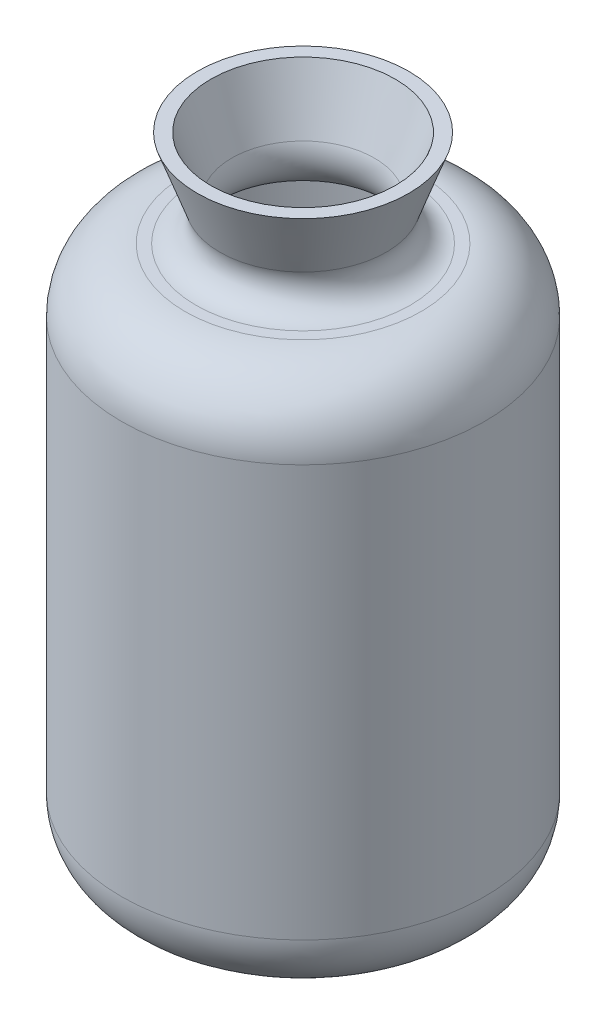
ISO-10303-21;
HEADER;
FILE_DESCRIPTION(('STEP AP214'),'2;1');
FILE_NAME('part.step','',(''),(''),'','','');
FILE_SCHEMA(('AUTOMOTIVE_DESIGN { 1 0 10303 214 1 1 1 1 }'));
ENDSEC;
DATA;
#1=APPLICATION_CONTEXT('core data for automotive mechanical design processes');
#2=APPLICATION_PROTOCOL_DEFINITION('international standard','automotive_design',2000,#1);
#3=PRODUCT_CONTEXT('',#1,'mechanical');
#4=PRODUCT('Part','Part','',(#3));
#5=PRODUCT_RELATED_PRODUCT_CATEGORY('part','',(#4));
#6=PRODUCT_DEFINITION_FORMATION('','',#4);
#7=PRODUCT_DEFINITION_CONTEXT('part definition',#1,'design');
#8=PRODUCT_DEFINITION('design','',#6,#7);
#9=PRODUCT_DEFINITION_SHAPE('','',#8);
#10=(LENGTH_UNIT() NAMED_UNIT(*) SI_UNIT(.MILLI.,.METRE.));
#11=(NAMED_UNIT(*) PLANE_ANGLE_UNIT() SI_UNIT($,.RADIAN.));
#12=(NAMED_UNIT(*) SI_UNIT($,.STERADIAN.) SOLID_ANGLE_UNIT());
#13=UNCERTAINTY_MEASURE_WITH_UNIT(LENGTH_MEASURE(1.E-05),#10,'distance_accuracy_value','');
#14=(GEOMETRIC_REPRESENTATION_CONTEXT(3) GLOBAL_UNCERTAINTY_ASSIGNED_CONTEXT((#13)) GLOBAL_UNIT_ASSIGNED_CONTEXT((#10,
#11,#12)) REPRESENTATION_CONTEXT('',''));
#15=CARTESIAN_POINT('',(0.,0.,0.));
#16=DIRECTION('',(0.,0.,1.));
#17=DIRECTION('',(1.,0.,0.));
#18=AXIS2_PLACEMENT_3D('',#15,#16,#17);
#19=CARTESIAN_POINT('',(0.,68.3137096774193,0.));
#20=DIRECTION('',(0.,1.,0.));
#21=DIRECTION('',(0.,0.,1.));
#22=AXIS2_PLACEMENT_3D('',#19,#20,#21);
#23=PLANE('',#22);
#24=CARTESIAN_POINT('',(0.,68.3137096774193,0.));
#25=DIRECTION('',(0.,1.,0.));
#26=DIRECTION('',(0.,0.,1.));
#27=AXIS2_PLACEMENT_3D('',#24,#25,#26);
#28=CIRCLE('',#27,18.4591743630947);
#29=CARTESIAN_POINT('',(0.,68.3137096774193,18.4591743630947));
#30=VERTEX_POINT('',#29);
#31=EDGE_CURVE('E74',#30,#30,#28,.T.);
#32=ORIENTED_EDGE('',*,*,#31,.F.);
#33=EDGE_LOOP('',(#32));
#34=FACE_BOUND('',#33,.T.);
#35=CARTESIAN_POINT('',(0.,68.3137096774193,0.));
#36=DIRECTION('',(0.,1.,0.));
#37=DIRECTION('',(0.,0.,1.));
#38=AXIS2_PLACEMENT_3D('',#35,#36,#37);
#39=CIRCLE('',#38,21.1602209553486);
#40=CARTESIAN_POINT('',(0.,68.3137096774193,21.1602209553486));
#41=VERTEX_POINT('',#40);
#42=EDGE_CURVE('E10',#41,#41,#39,.T.);
#43=ORIENTED_EDGE('',*,*,#42,.T.);
#44=EDGE_LOOP('',(#43));
#45=FACE_BOUND('',#44,.T.);
#46=ADVANCED_FACE('F39',(#34,#45),#23,.T.);
#47=CARTESIAN_POINT('',(0.,68.3137096774193,0.));
#48=DIRECTION('',(0.,1.,0.));
#49=DIRECTION('',(0.,0.,1.));
#50=AXIS2_PLACEMENT_3D('',#47,#48,#49);
#51=CONICAL_SURFACE('',#50,21.1602209553486,0.347061603539491);
#52=CARTESIAN_POINT('',(0.,55.8667622625465,0.));
#53=DIRECTION('',(0.,1.,0.));
#54=DIRECTION('',(0.,0.,1.));
#55=AXIS2_PLACEMENT_3D('',#52,#53,#54);
#56=CIRCLE('',#55,16.6581335925223);
#57=CARTESIAN_POINT('',(0.,55.8667622625465,16.6581335925223));
#58=VERTEX_POINT('',#57);
#59=EDGE_CURVE('E46',#58,#58,#56,.T.);
#60=ORIENTED_EDGE('',*,*,#59,.T.);
#61=EDGE_LOOP('',(#60));
#62=FACE_BOUND('',#61,.T.);
#63=ORIENTED_EDGE('',*,*,#42,.F.);
#64=EDGE_LOOP('',(#63));
#65=FACE_BOUND('',#64,.T.);
#66=ADVANCED_FACE('F113',(#62,#65),#51,.T.);
#67=CARTESIAN_POINT('',(0.,54.1388709677419,0.));
#68=DIRECTION('',(0.,1.,0.));
#69=DIRECTION('',(0.,0.,1.));
#70=AXIS2_PLACEMENT_3D('',#67,#68,#69);
#71=TOROIDAL_SURFACE('',#70,21.4352448193348,5.08);
#72=CARTESIAN_POINT('',(0.,49.0588709677419,0.));
#73=DIRECTION('',(0.,1.,0.));
#74=DIRECTION('',(0.,0.,1.));
#75=AXIS2_PLACEMENT_3D('',#72,#73,#74);
#76=CIRCLE('',#75,21.4352448193349);
#77=CARTESIAN_POINT('',(0.,49.0588709677419,21.4352448193349));
#78=VERTEX_POINT('',#77);
#79=EDGE_CURVE('E51',#78,#78,#76,.T.);
#80=ORIENTED_EDGE('',*,*,#79,.T.);
#81=EDGE_LOOP('',(#80));
#82=FACE_BOUND('',#81,.T.);
#83=ORIENTED_EDGE('',*,*,#59,.F.);
#84=EDGE_LOOP('',(#83));
#85=FACE_BOUND('',#84,.T.);
#86=ADVANCED_FACE('F117',(#82,#85),#71,.F.);
#87=CARTESIAN_POINT('',(-21.4352448193349,49.0588709677419,0.));
#88=DIRECTION('',(0.,1.,0.));
#89=DIRECTION('',(0.,0.,1.));
#90=AXIS2_PLACEMENT_3D('',#87,#88,#89);
#91=PLANE('',#90);
#92=CARTESIAN_POINT('',(0.,49.0588709677419,0.));
#93=DIRECTION('',(0.,1.,0.));
#94=DIRECTION('',(0.,0.,1.));
#95=AXIS2_PLACEMENT_3D('',#92,#93,#94);
#96=CIRCLE('',#95,23.6182854714775);
#97=CARTESIAN_POINT('',(0.,49.0588709677419,23.6182854714775));
#98=VERTEX_POINT('',#97);
#99=EDGE_CURVE('E56',#98,#98,#96,.T.);
#100=ORIENTED_EDGE('',*,*,#99,.T.);
#101=EDGE_LOOP('',(#100));
#102=FACE_BOUND('',#101,.T.);
#103=ORIENTED_EDGE('',*,*,#79,.F.);
#104=EDGE_LOOP('',(#103));
#105=FACE_BOUND('',#104,.T.);
#106=ADVANCED_FACE('F121',(#102,#105),#91,.T.);
#107=CARTESIAN_POINT('',(0.,36.3588709677419,0.));
#108=DIRECTION('',(0.,1.,0.));
#109=DIRECTION('',(0.,0.,1.));
#110=AXIS2_PLACEMENT_3D('',#107,#108,#109);
#111=TOROIDAL_SURFACE('',#110,23.6182854714776,12.7);
#112=CARTESIAN_POINT('',(0.,36.3588709677419,0.));
#113=DIRECTION('',(0.,1.,0.));
#114=DIRECTION('',(0.,0.,1.));
#115=AXIS2_PLACEMENT_3D('',#112,#113,#114);
#116=CIRCLE('',#115,36.3182854714776);
#117=CARTESIAN_POINT('',(0.,36.3588709677419,36.3182854714776));
#118=VERTEX_POINT('',#117);
#119=EDGE_CURVE('E62',#118,#118,#116,.T.);
#120=ORIENTED_EDGE('',*,*,#119,.T.);
#121=EDGE_LOOP('',(#120));
#122=FACE_BOUND('',#121,.T.);
#123=ORIENTED_EDGE('',*,*,#99,.F.);
#124=EDGE_LOOP('',(#123));
#125=FACE_BOUND('',#124,.T.);
#126=ADVANCED_FACE('F128',(#122,#125),#111,.T.);
#127=CARTESIAN_POINT('',(0.,68.3137096774193,0.));
#128=DIRECTION('',(0.,1.,0.));
#129=DIRECTION('',(0.,0.,1.));
#130=AXIS2_PLACEMENT_3D('',#127,#128,#129);
#131=CYLINDRICAL_SURFACE('',#130,36.3182854714776);
#132=CARTESIAN_POINT('',(0.,-45.9862903225806,0.));
#133=DIRECTION('',(0.,1.,0.));
#134=DIRECTION('',(0.,0.,1.));
#135=AXIS2_PLACEMENT_3D('',#132,#133,#134);
#136=CIRCLE('',#135,36.3182854714776);
#137=CARTESIAN_POINT('',(0.,-45.9862903225806,36.3182854714776));
#138=VERTEX_POINT('',#137);
#139=EDGE_CURVE('E66',#138,#138,#136,.T.);
#140=ORIENTED_EDGE('',*,*,#139,.T.);
#141=EDGE_LOOP('',(#140));
#142=FACE_BOUND('',#141,.T.);
#143=ORIENTED_EDGE('',*,*,#119,.F.);
#144=EDGE_LOOP('',(#143));
#145=FACE_BOUND('',#144,.T.);
#146=ADVANCED_FACE('F132',(#142,#145),#131,.T.);
#147=CARTESIAN_POINT('',(0.,-45.9862903225806,0.));
#148=DIRECTION('',(0.,1.,0.));
#149=DIRECTION('',(0.,0.,1.));
#150=AXIS2_PLACEMENT_3D('',#147,#148,#149);
#151=TOROIDAL_SURFACE('',#150,23.6182854714776,12.7);
#152=CARTESIAN_POINT('',(0.,-58.6862903225807,0.));
#153=DIRECTION('',(0.,1.,0.));
#154=DIRECTION('',(0.,0.,1.));
#155=AXIS2_PLACEMENT_3D('',#152,#153,#154);
#156=CIRCLE('',#155,23.6182854714776);
#157=CARTESIAN_POINT('',(0.,-58.6862903225807,23.6182854714776));
#158=VERTEX_POINT('',#157);
#159=EDGE_CURVE('E70',#158,#158,#156,.T.);
#160=ORIENTED_EDGE('',*,*,#159,.T.);
#161=EDGE_LOOP('',(#160));
#162=FACE_BOUND('',#161,.T.);
#163=ORIENTED_EDGE('',*,*,#139,.F.);
#164=EDGE_LOOP('',(#163));
#165=FACE_BOUND('',#164,.T.);
#166=ADVANCED_FACE('F136',(#162,#165),#151,.T.);
#167=CARTESIAN_POINT('',(-23.6182854714775,-58.6862903225806,0.));
#168=DIRECTION('',(0.,-1.,0.));
#169=DIRECTION('',(0.,0.,-1.));
#170=AXIS2_PLACEMENT_3D('',#167,#168,#169);
#171=PLANE('',#170);
#172=ORIENTED_EDGE('',*,*,#159,.F.);
#173=EDGE_LOOP('',(#172));
#174=FACE_BOUND('',#173,.T.);
#175=ADVANCED_FACE('F108',(#174),#171,.T.);
#176=CARTESIAN_POINT('',(0.,69.1776553248216,0.));
#177=DIRECTION('',(0.,1.,0.));
#178=DIRECTION('',(0.,0.,1.));
#179=AXIS2_PLACEMENT_3D('',#176,#177,#178);
#180=CONICAL_SURFACE('',#179,18.7716653419423,0.347061603539491);
#181=CARTESIAN_POINT('',(0.,56.7307079099488,0.));
#182=DIRECTION('',(0.,1.,0.));
#183=DIRECTION('',(0.,0.,1.));
#184=AXIS2_PLACEMENT_3D('',#181,#182,#183);
#185=CIRCLE('',#184,14.269577979116);
#186=CARTESIAN_POINT('',(0.,56.7307079099488,14.269577979116));
#187=VERTEX_POINT('',#186);
#188=EDGE_CURVE('E78',#187,#187,#185,.T.);
#189=ORIENTED_EDGE('',*,*,#188,.F.);
#190=EDGE_LOOP('',(#189));
#191=FACE_BOUND('',#190,.T.);
#192=ORIENTED_EDGE('',*,*,#31,.T.);
#193=EDGE_LOOP('',(#192));
#194=FACE_BOUND('',#193,.T.);
#195=ADVANCED_FACE('F105',(#191,#194),#180,.F.);
#196=CARTESIAN_POINT('',(0.,54.1388709677419,0.));
#197=DIRECTION('',(0.,1.,0.));
#198=DIRECTION('',(0.,0.,1.));
#199=AXIS2_PLACEMENT_3D('',#196,#197,#198);
#200=TOROIDAL_SURFACE('',#199,21.4352448193348,7.62);
#201=CARTESIAN_POINT('',(0.,46.5188709677419,0.));
#202=DIRECTION('',(0.,1.,0.));
#203=DIRECTION('',(0.,0.,1.));
#204=AXIS2_PLACEMENT_3D('',#201,#202,#203);
#205=CIRCLE('',#204,21.4352448193349);
#206=CARTESIAN_POINT('',(0.,46.5188709677419,21.4352448193349));
#207=VERTEX_POINT('',#206);
#208=EDGE_CURVE('E95',#207,#207,#205,.T.);
#209=ORIENTED_EDGE('',*,*,#208,.F.);
#210=EDGE_LOOP('',(#209));
#211=FACE_BOUND('',#210,.T.);
#212=ORIENTED_EDGE('',*,*,#188,.T.);
#213=EDGE_LOOP('',(#212));
#214=FACE_BOUND('',#213,.T.);
#215=ADVANCED_FACE('F103',(#211,#214),#200,.T.);
#216=CARTESIAN_POINT('',(-21.4352448193349,46.5188709677419,0.));
#217=DIRECTION('',(0.,1.,0.));
#218=DIRECTION('',(0.,0.,1.));
#219=AXIS2_PLACEMENT_3D('',#216,#217,#218);
#220=PLANE('',#219);
#221=CARTESIAN_POINT('',(0.,46.5188709677419,0.));
#222=DIRECTION('',(0.,1.,0.));
#223=DIRECTION('',(0.,0.,1.));
#224=AXIS2_PLACEMENT_3D('',#221,#222,#223);
#225=CIRCLE('',#224,23.6182854714776);
#226=CARTESIAN_POINT('',(0.,46.5188709677419,23.6182854714776));
#227=VERTEX_POINT('',#226);
#228=EDGE_CURVE('E91',#227,#227,#225,.T.);
#229=ORIENTED_EDGE('',*,*,#228,.F.);
#230=EDGE_LOOP('',(#229));
#231=FACE_BOUND('',#230,.T.);
#232=ORIENTED_EDGE('',*,*,#208,.T.);
#233=EDGE_LOOP('',(#232));
#234=FACE_BOUND('',#233,.T.);
#235=ADVANCED_FACE('F159',(#231,#234),#220,.F.);
#236=CARTESIAN_POINT('',(0.,36.3588709677419,0.));
#237=DIRECTION('',(0.,1.,0.));
#238=DIRECTION('',(0.,0.,1.));
#239=AXIS2_PLACEMENT_3D('',#236,#237,#238);
#240=TOROIDAL_SURFACE('',#239,23.6182854714776,10.16);
#241=CARTESIAN_POINT('',(0.,36.3588709677419,0.));
#242=DIRECTION('',(0.,1.,0.));
#243=DIRECTION('',(0.,0.,1.));
#244=AXIS2_PLACEMENT_3D('',#241,#242,#243);
#245=CIRCLE('',#244,33.7782854714776);
#246=CARTESIAN_POINT('',(0.,36.3588709677419,33.7782854714776));
#247=VERTEX_POINT('',#246);
#248=EDGE_CURVE('E87',#247,#247,#245,.T.);
#249=ORIENTED_EDGE('',*,*,#248,.F.);
#250=EDGE_LOOP('',(#249));
#251=FACE_BOUND('',#250,.T.);
#252=ORIENTED_EDGE('',*,*,#228,.T.);
#253=EDGE_LOOP('',(#252));
#254=FACE_BOUND('',#253,.T.);
#255=ADVANCED_FACE('F155',(#251,#254),#240,.F.);
#256=CARTESIAN_POINT('',(0.,68.3137096774193,0.));
#257=DIRECTION('',(0.,1.,0.));
#258=DIRECTION('',(0.,0.,1.));
#259=AXIS2_PLACEMENT_3D('',#256,#257,#258);
#260=CYLINDRICAL_SURFACE('',#259,33.7782854714776);
#261=CARTESIAN_POINT('',(0.,-45.9862903225806,0.));
#262=DIRECTION('',(0.,1.,0.));
#263=DIRECTION('',(0.,0.,1.));
#264=AXIS2_PLACEMENT_3D('',#261,#262,#263);
#265=CIRCLE('',#264,33.7782854714776);
#266=CARTESIAN_POINT('',(0.,-45.9862903225806,33.7782854714776));
#267=VERTEX_POINT('',#266);
#268=EDGE_CURVE('E83',#267,#267,#265,.T.);
#269=ORIENTED_EDGE('',*,*,#268,.F.);
#270=EDGE_LOOP('',(#269));
#271=FACE_BOUND('',#270,.T.);
#272=ORIENTED_EDGE('',*,*,#248,.T.);
#273=EDGE_LOOP('',(#272));
#274=FACE_BOUND('',#273,.T.);
#275=ADVANCED_FACE('F151',(#271,#274),#260,.F.);
#276=CARTESIAN_POINT('',(0.,-45.9862903225806,0.));
#277=DIRECTION('',(0.,1.,0.));
#278=DIRECTION('',(0.,0.,1.));
#279=AXIS2_PLACEMENT_3D('',#276,#277,#278);
#280=TOROIDAL_SURFACE('',#279,23.6182854714776,10.16);
#281=CARTESIAN_POINT('',(0.,-56.1462903225806,0.));
#282=DIRECTION('',(0.,1.,0.));
#283=DIRECTION('',(0.,0.,1.));
#284=AXIS2_PLACEMENT_3D('',#281,#282,#283);
#285=CIRCLE('',#284,23.6182854714776);
#286=CARTESIAN_POINT('',(0.,-56.1462903225806,23.6182854714776));
#287=VERTEX_POINT('',#286);
#288=EDGE_CURVE('E79',#287,#287,#285,.T.);
#289=ORIENTED_EDGE('',*,*,#288,.F.);
#290=EDGE_LOOP('',(#289));
#291=FACE_BOUND('',#290,.T.);
#292=ORIENTED_EDGE('',*,*,#268,.T.);
#293=EDGE_LOOP('',(#292));
#294=FACE_BOUND('',#293,.T.);
#295=ADVANCED_FACE('F147',(#291,#294),#280,.F.);
#296=CARTESIAN_POINT('',(-23.6182854714775,-56.1462903225806,0.));
#297=DIRECTION('',(0.,-1.,0.));
#298=DIRECTION('',(0.,0.,-1.));
#299=AXIS2_PLACEMENT_3D('',#296,#297,#298);
#300=PLANE('',#299);
#301=ORIENTED_EDGE('',*,*,#288,.T.);
#302=EDGE_LOOP('',(#301));
#303=FACE_BOUND('',#302,.T.);
#304=ADVANCED_FACE('F144',(#303),#300,.F.);
#305=CLOSED_SHELL('',(#46,#66,#86,#106,#126,#146,#166,#175,#195,#215,#235,#255,#275,#295,#304));
#306=MANIFOLD_SOLID_BREP('B2',#305);
#307=ADVANCED_BREP_SHAPE_REPRESENTATION('',(#18,#306),#14);
#308=SHAPE_DEFINITION_REPRESENTATION(#9,#307);
ENDSEC;
END-ISO-10303-21;
